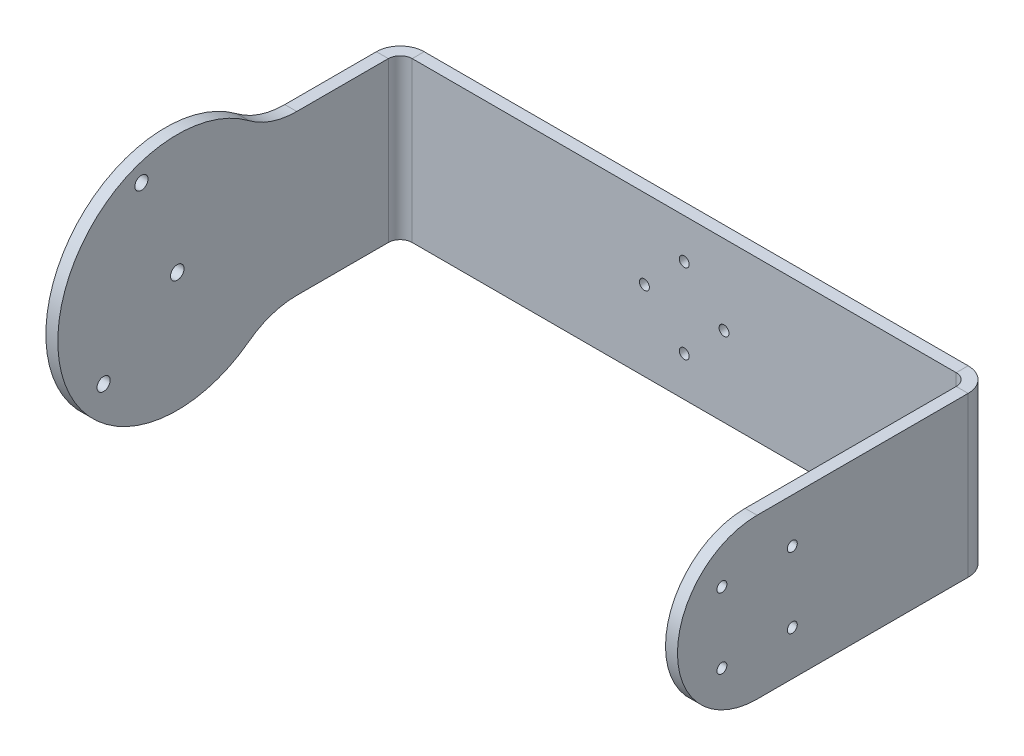
ISO-10303-21;
HEADER;
FILE_DESCRIPTION(('STEP AP214'),'2;1');
FILE_NAME('part.step','',(''),(''),'','','');
FILE_SCHEMA(('AUTOMOTIVE_DESIGN { 1 0 10303 214 1 1 1 1 }'));
ENDSEC;
DATA;
#1=APPLICATION_CONTEXT('core data for automotive mechanical design processes');
#2=APPLICATION_PROTOCOL_DEFINITION('international standard','automotive_design',2000,#1);
#3=PRODUCT_CONTEXT('',#1,'mechanical');
#4=PRODUCT('Part','Part','',(#3));
#5=PRODUCT_RELATED_PRODUCT_CATEGORY('part','',(#4));
#6=PRODUCT_DEFINITION_FORMATION('','',#4);
#7=PRODUCT_DEFINITION_CONTEXT('part definition',#1,'design');
#8=PRODUCT_DEFINITION('design','',#6,#7);
#9=PRODUCT_DEFINITION_SHAPE('','',#8);
#10=(LENGTH_UNIT() NAMED_UNIT(*) SI_UNIT(.MILLI.,.METRE.));
#11=(NAMED_UNIT(*) PLANE_ANGLE_UNIT() SI_UNIT($,.RADIAN.));
#12=(NAMED_UNIT(*) SI_UNIT($,.STERADIAN.) SOLID_ANGLE_UNIT());
#13=UNCERTAINTY_MEASURE_WITH_UNIT(LENGTH_MEASURE(1.E-05),#10,'distance_accuracy_value','');
#14=(GEOMETRIC_REPRESENTATION_CONTEXT(3) GLOBAL_UNCERTAINTY_ASSIGNED_CONTEXT((#13)) GLOBAL_UNIT_ASSIGNED_CONTEXT((#10,
#11,#12)) REPRESENTATION_CONTEXT('',''));
#15=CARTESIAN_POINT('',(0.,0.,0.));
#16=DIRECTION('',(0.,0.,1.));
#17=DIRECTION('',(1.,0.,0.));
#18=AXIS2_PLACEMENT_3D('',#15,#16,#17);
#19=CARTESIAN_POINT('',(0.,0.,-3.));
#20=DIRECTION('',(0.,0.,1.));
#21=DIRECTION('',(1.,0.,0.));
#22=AXIS2_PLACEMENT_3D('',#19,#20,#21);
#23=PLANE('',#22);
#24=CARTESIAN_POINT('',(0.,-10.,-3.));
#25=DIRECTION('',(0.,0.,1.));
#26=DIRECTION('',(1.,0.,0.));
#27=AXIS2_PLACEMENT_3D('',#24,#25,#26);
#28=CIRCLE('',#27,1.25);
#29=CARTESIAN_POINT('',(1.24999999999993,-10.,-3.));
#30=VERTEX_POINT('',#29);
#31=EDGE_CURVE('E379',#30,#30,#28,.F.);
#32=ORIENTED_EDGE('',*,*,#31,.F.);
#33=EDGE_LOOP('',(#32));
#34=FACE_BOUND('',#33,.T.);
#35=CARTESIAN_POINT('',(10.,0.,-3.));
#36=DIRECTION('',(0.,0.,1.));
#37=DIRECTION('',(1.,0.,0.));
#38=AXIS2_PLACEMENT_3D('',#35,#36,#37);
#39=CIRCLE('',#38,1.25);
#40=CARTESIAN_POINT('',(11.25,0.,-3.));
#41=VERTEX_POINT('',#40);
#42=EDGE_CURVE('E384',#41,#41,#39,.F.);
#43=ORIENTED_EDGE('',*,*,#42,.F.);
#44=EDGE_LOOP('',(#43));
#45=FACE_BOUND('',#44,.T.);
#46=CARTESIAN_POINT('',(0.,10.,-3.));
#47=DIRECTION('',(0.,0.,1.));
#48=DIRECTION('',(1.,0.,0.));
#49=AXIS2_PLACEMENT_3D('',#46,#47,#48);
#50=CIRCLE('',#49,1.25);
#51=CARTESIAN_POINT('',(1.25,10.,-3.));
#52=VERTEX_POINT('',#51);
#53=EDGE_CURVE('E390',#52,#52,#50,.F.);
#54=ORIENTED_EDGE('',*,*,#53,.F.);
#55=EDGE_LOOP('',(#54));
#56=FACE_BOUND('',#55,.T.);
#57=CARTESIAN_POINT('',(-10.,1.04744440165294E-13,-3.));
#58=DIRECTION('',(0.,0.,1.));
#59=DIRECTION('',(1.,0.,0.));
#60=AXIS2_PLACEMENT_3D('',#57,#58,#59);
#61=CIRCLE('',#60,1.25);
#62=CARTESIAN_POINT('',(-8.75,1.04744440165294E-13,-3.));
#63=VERTEX_POINT('',#62);
#64=EDGE_CURVE('E171',#63,#63,#61,.F.);
#65=ORIENTED_EDGE('',*,*,#64,.F.);
#66=EDGE_LOOP('',(#65));
#67=FACE_BOUND('',#66,.T.);
#68=DIRECTION('',(0.,1.,0.));
#69=VECTOR('',#68,1.);
#70=CARTESIAN_POINT('',(68.3,20.,-3.));
#71=LINE('',#70,#69);
#72=CARTESIAN_POINT('',(68.3,20.,-3.));
#73=VERTEX_POINT('',#72);
#74=CARTESIAN_POINT('',(68.3,-20.,-3.));
#75=VERTEX_POINT('',#74);
#76=EDGE_CURVE('E197',#73,#75,#71,.F.);
#77=ORIENTED_EDGE('',*,*,#76,.T.);
#78=DIRECTION('',(1.,0.,0.));
#79=VECTOR('',#78,1.);
#80=CARTESIAN_POINT('',(-71.3,-20.,-3.));
#81=LINE('',#80,#79);
#82=CARTESIAN_POINT('',(-68.3,-20.,-3.));
#83=VERTEX_POINT('',#82);
#84=EDGE_CURVE('E265',#83,#75,#81,.T.);
#85=ORIENTED_EDGE('',*,*,#84,.F.);
#86=DIRECTION('',(0.,-1.,0.));
#87=VECTOR('',#86,1.);
#88=CARTESIAN_POINT('',(-68.3,-20.,-3.));
#89=LINE('',#88,#87);
#90=CARTESIAN_POINT('',(-68.3,20.,-3.));
#91=VERTEX_POINT('',#90);
#92=EDGE_CURVE('E241',#83,#91,#89,.F.);
#93=ORIENTED_EDGE('',*,*,#92,.T.);
#94=DIRECTION('',(-1.,0.,0.));
#95=VECTOR('',#94,1.);
#96=CARTESIAN_POINT('',(-71.3,20.,-3.));
#97=LINE('',#96,#95);
#98=EDGE_CURVE('E268',#73,#91,#97,.T.);
#99=ORIENTED_EDGE('',*,*,#98,.F.);
#100=EDGE_LOOP('',(#77,#85,#93,#99));
#101=FACE_BOUND('',#100,.T.);
#102=ADVANCED_FACE('F60',(#34,#45,#56,#67,#101),#23,.F.);
#103=CARTESIAN_POINT('',(0.,0.,0.));
#104=DIRECTION('',(0.,0.,1.));
#105=DIRECTION('',(1.,0.,0.));
#106=AXIS2_PLACEMENT_3D('',#103,#104,#105);
#107=PLANE('',#106);
#108=CARTESIAN_POINT('',(0.,-10.,0.));
#109=DIRECTION('',(0.,0.,1.));
#110=DIRECTION('',(1.,0.,0.));
#111=AXIS2_PLACEMENT_3D('',#108,#109,#110);
#112=CIRCLE('',#111,1.25);
#113=CARTESIAN_POINT('',(1.24999999999993,-10.,0.));
#114=VERTEX_POINT('',#113);
#115=EDGE_CURVE('E376',#114,#114,#112,.T.);
#116=ORIENTED_EDGE('',*,*,#115,.F.);
#117=EDGE_LOOP('',(#116));
#118=FACE_BOUND('',#117,.T.);
#119=CARTESIAN_POINT('',(10.,0.,0.));
#120=DIRECTION('',(0.,0.,1.));
#121=DIRECTION('',(1.,0.,0.));
#122=AXIS2_PLACEMENT_3D('',#119,#120,#121);
#123=CIRCLE('',#122,1.25);
#124=CARTESIAN_POINT('',(11.25,0.,0.));
#125=VERTEX_POINT('',#124);
#126=EDGE_CURVE('E380',#125,#125,#123,.T.);
#127=ORIENTED_EDGE('',*,*,#126,.F.);
#128=EDGE_LOOP('',(#127));
#129=FACE_BOUND('',#128,.T.);
#130=CARTESIAN_POINT('',(0.,10.,0.));
#131=DIRECTION('',(0.,0.,1.));
#132=DIRECTION('',(1.,0.,0.));
#133=AXIS2_PLACEMENT_3D('',#130,#131,#132);
#134=CIRCLE('',#133,1.25);
#135=CARTESIAN_POINT('',(1.25,10.,0.));
#136=VERTEX_POINT('',#135);
#137=EDGE_CURVE('E387',#136,#136,#134,.T.);
#138=ORIENTED_EDGE('',*,*,#137,.F.);
#139=EDGE_LOOP('',(#138));
#140=FACE_BOUND('',#139,.T.);
#141=CARTESIAN_POINT('',(-10.,1.04744440165294E-13,0.));
#142=DIRECTION('',(0.,0.,1.));
#143=DIRECTION('',(1.,0.,0.));
#144=AXIS2_PLACEMENT_3D('',#141,#142,#143);
#145=CIRCLE('',#144,1.25);
#146=CARTESIAN_POINT('',(-8.75,1.04744440165294E-13,0.));
#147=VERTEX_POINT('',#146);
#148=EDGE_CURVE('E393',#147,#147,#145,.T.);
#149=ORIENTED_EDGE('',*,*,#148,.F.);
#150=EDGE_LOOP('',(#149));
#151=FACE_BOUND('',#150,.T.);
#152=DIRECTION('',(1.,0.,0.));
#153=VECTOR('',#152,1.);
#154=CARTESIAN_POINT('',(-71.3,-20.,0.));
#155=LINE('',#154,#153);
#156=CARTESIAN_POINT('',(-68.3,-20.,0.));
#157=VERTEX_POINT('',#156);
#158=CARTESIAN_POINT('',(68.3,-20.,0.));
#159=VERTEX_POINT('',#158);
#160=EDGE_CURVE('E262',#157,#159,#155,.T.);
#161=ORIENTED_EDGE('',*,*,#160,.T.);
#162=DIRECTION('',(0.,1.,0.));
#163=VECTOR('',#162,1.);
#164=CARTESIAN_POINT('',(68.3,20.,0.));
#165=LINE('',#164,#163);
#166=CARTESIAN_POINT('',(68.3,20.,0.));
#167=VERTEX_POINT('',#166);
#168=EDGE_CURVE('E209',#167,#159,#165,.F.);
#169=ORIENTED_EDGE('',*,*,#168,.F.);
#170=DIRECTION('',(-1.,0.,0.));
#171=VECTOR('',#170,1.);
#172=CARTESIAN_POINT('',(-71.3,20.,0.));
#173=LINE('',#172,#171);
#174=CARTESIAN_POINT('',(-68.3,20.,0.));
#175=VERTEX_POINT('',#174);
#176=EDGE_CURVE('E269',#167,#175,#173,.T.);
#177=ORIENTED_EDGE('',*,*,#176,.T.);
#178=DIRECTION('',(0.,-1.,0.));
#179=VECTOR('',#178,1.);
#180=CARTESIAN_POINT('',(-68.3,-20.,0.));
#181=LINE('',#180,#179);
#182=EDGE_CURVE('E254',#157,#175,#181,.F.);
#183=ORIENTED_EDGE('',*,*,#182,.F.);
#184=EDGE_LOOP('',(#161,#169,#177,#183));
#185=FACE_BOUND('',#184,.T.);
#186=ADVANCED_FACE('F326',(#118,#129,#140,#151,#185),#107,.T.);
#187=CARTESIAN_POINT('',(-71.3,20.,-3.));
#188=DIRECTION('',(0.,1.,0.));
#189=DIRECTION('',(0.,0.,1.));
#190=AXIS2_PLACEMENT_3D('',#187,#188,#189);
#191=PLANE('',#190);
#192=ORIENTED_EDGE('',*,*,#176,.F.);
#193=DIRECTION('',(0.,0.,-1.));
#194=VECTOR('',#193,1.);
#195=CARTESIAN_POINT('',(68.3,20.,0.));
#196=LINE('',#195,#194);
#197=EDGE_CURVE('E203',#167,#73,#196,.T.);
#198=ORIENTED_EDGE('',*,*,#197,.T.);
#199=ORIENTED_EDGE('',*,*,#98,.T.);
#200=DIRECTION('',(0.,0.,-1.));
#201=VECTOR('',#200,1.);
#202=CARTESIAN_POINT('',(-68.3,20.,0.));
#203=LINE('',#202,#201);
#204=EDGE_CURVE('E259',#175,#91,#203,.T.);
#205=ORIENTED_EDGE('',*,*,#204,.F.);
#206=EDGE_LOOP('',(#192,#198,#199,#205));
#207=FACE_BOUND('',#206,.T.);
#208=ADVANCED_FACE('F319',(#207),#191,.T.);
#209=CARTESIAN_POINT('',(-71.3,-20.,-3.));
#210=DIRECTION('',(0.,-1.,0.));
#211=DIRECTION('',(0.,0.,-1.));
#212=AXIS2_PLACEMENT_3D('',#209,#210,#211);
#213=PLANE('',#212);
#214=DIRECTION('',(0.,0.,-1.));
#215=VECTOR('',#214,1.);
#216=CARTESIAN_POINT('',(68.3,-20.,0.));
#217=LINE('',#216,#215);
#218=EDGE_CURVE('E214',#159,#75,#217,.T.);
#219=ORIENTED_EDGE('',*,*,#218,.F.);
#220=ORIENTED_EDGE('',*,*,#160,.F.);
#221=DIRECTION('',(0.,0.,-1.));
#222=VECTOR('',#221,1.);
#223=CARTESIAN_POINT('',(-68.3,-20.,0.));
#224=LINE('',#223,#222);
#225=EDGE_CURVE('E248',#157,#83,#224,.T.);
#226=ORIENTED_EDGE('',*,*,#225,.T.);
#227=ORIENTED_EDGE('',*,*,#84,.T.);
#228=EDGE_LOOP('',(#219,#220,#226,#227));
#229=FACE_BOUND('',#228,.T.);
#230=ADVANCED_FACE('F329',(#229),#213,.T.);
#231=CARTESIAN_POINT('',(-68.3,20.,3.));
#232=DIRECTION('',(0.,1.,0.));
#233=DIRECTION('',(0.,0.,1.));
#234=AXIS2_PLACEMENT_3D('',#231,#232,#233);
#235=PLANE('',#234);
#236=DIRECTION('',(-1.,0.,0.));
#237=VECTOR('',#236,1.);
#238=CARTESIAN_POINT('',(-71.3,20.,2.99999999999999));
#239=LINE('',#238,#237);
#240=CARTESIAN_POINT('',(-71.3,20.,2.99999999999999));
#241=VERTEX_POINT('',#240);
#242=CARTESIAN_POINT('',(-74.3,20.,2.99999999999998));
#243=VERTEX_POINT('',#242);
#244=EDGE_CURVE('E217',#241,#243,#239,.T.);
#245=ORIENTED_EDGE('',*,*,#244,.F.);
#246=CARTESIAN_POINT('',(-68.3,20.,3.));
#247=DIRECTION('',(0.,-1.,0.));
#248=DIRECTION('',(0.,0.,-1.));
#249=AXIS2_PLACEMENT_3D('',#246,#247,#248);
#250=CIRCLE('',#249,3.);
#251=EDGE_CURVE('E251',#175,#241,#250,.F.);
#252=ORIENTED_EDGE('',*,*,#251,.F.);
#253=ORIENTED_EDGE('',*,*,#204,.T.);
#254=CARTESIAN_POINT('',(-68.3,20.,3.));
#255=DIRECTION('',(0.,-1.,0.));
#256=DIRECTION('',(0.,0.,-1.));
#257=AXIS2_PLACEMENT_3D('',#254,#255,#256);
#258=CIRCLE('',#257,6.);
#259=EDGE_CURVE('E244',#91,#243,#258,.F.);
#260=ORIENTED_EDGE('',*,*,#259,.T.);
#261=EDGE_LOOP('',(#245,#252,#253,#260));
#262=FACE_BOUND('',#261,.T.);
#263=ADVANCED_FACE('F314',(#262),#235,.T.);
#264=CARTESIAN_POINT('',(-68.3,-20.,3.));
#265=DIRECTION('',(0.,1.,0.));
#266=DIRECTION('',(0.,0.,1.));
#267=AXIS2_PLACEMENT_3D('',#264,#265,#266);
#268=PLANE('',#267);
#269=CARTESIAN_POINT('',(-68.3,-20.,3.));
#270=DIRECTION('',(0.,-1.,0.));
#271=DIRECTION('',(0.,0.,-1.));
#272=AXIS2_PLACEMENT_3D('',#269,#270,#271);
#273=CIRCLE('',#272,3.);
#274=CARTESIAN_POINT('',(-71.3,-20.,2.99999999999999));
#275=VERTEX_POINT('',#274);
#276=EDGE_CURVE('E237',#275,#157,#273,.T.);
#277=ORIENTED_EDGE('',*,*,#276,.F.);
#278=DIRECTION('',(-1.,0.,0.));
#279=VECTOR('',#278,1.);
#280=CARTESIAN_POINT('',(-71.3,-20.,2.99999999999999));
#281=LINE('',#280,#279);
#282=CARTESIAN_POINT('',(-74.3,-20.,2.99999999999998));
#283=VERTEX_POINT('',#282);
#284=EDGE_CURVE('E222',#275,#283,#281,.T.);
#285=ORIENTED_EDGE('',*,*,#284,.T.);
#286=CARTESIAN_POINT('',(-68.3,-20.,3.));
#287=DIRECTION('',(0.,-1.,0.));
#288=DIRECTION('',(0.,0.,-1.));
#289=AXIS2_PLACEMENT_3D('',#286,#287,#288);
#290=CIRCLE('',#289,6.);
#291=EDGE_CURVE('E245',#283,#83,#290,.T.);
#292=ORIENTED_EDGE('',*,*,#291,.T.);
#293=ORIENTED_EDGE('',*,*,#225,.F.);
#294=EDGE_LOOP('',(#277,#285,#292,#293));
#295=FACE_BOUND('',#294,.T.);
#296=ADVANCED_FACE('F331',(#295),#268,.F.);
#297=CARTESIAN_POINT('',(-68.3,-20.,3.));
#298=DIRECTION('',(0.,-1.,0.));
#299=DIRECTION('',(-1.,0.,0.));
#300=AXIS2_PLACEMENT_3D('',#297,#298,#299);
#301=CYLINDRICAL_SURFACE('',#300,6.);
#302=ORIENTED_EDGE('',*,*,#92,.F.);
#303=ORIENTED_EDGE('',*,*,#291,.F.);
#304=DIRECTION('',(0.,1.,0.));
#305=VECTOR('',#304,1.);
#306=CARTESIAN_POINT('',(-74.3,0.,2.99999999999998));
#307=LINE('',#306,#305);
#308=EDGE_CURVE('E225',#283,#243,#307,.T.);
#309=ORIENTED_EDGE('',*,*,#308,.T.);
#310=ORIENTED_EDGE('',*,*,#259,.F.);
#311=EDGE_LOOP('',(#302,#303,#309,#310));
#312=FACE_BOUND('',#311,.T.);
#313=ADVANCED_FACE('F312',(#312),#301,.T.);
#314=CARTESIAN_POINT('',(-68.3,-20.,3.));
#315=DIRECTION('',(0.,-1.,0.));
#316=DIRECTION('',(-1.,0.,0.));
#317=AXIS2_PLACEMENT_3D('',#314,#315,#316);
#318=CYLINDRICAL_SURFACE('',#317,3.);
#319=ORIENTED_EDGE('',*,*,#182,.T.);
#320=ORIENTED_EDGE('',*,*,#251,.T.);
#321=DIRECTION('',(0.,-1.,0.));
#322=VECTOR('',#321,1.);
#323=CARTESIAN_POINT('',(-71.3,20.,2.99999999999999));
#324=LINE('',#323,#322);
#325=EDGE_CURVE('E220',#241,#275,#324,.T.);
#326=ORIENTED_EDGE('',*,*,#325,.T.);
#327=ORIENTED_EDGE('',*,*,#276,.T.);
#328=EDGE_LOOP('',(#319,#320,#326,#327));
#329=FACE_BOUND('',#328,.T.);
#330=ADVANCED_FACE('F322',(#329),#318,.F.);
#331=CARTESIAN_POINT('',(-74.3,20.,0.));
#332=DIRECTION('',(0.,-1.,0.));
#333=DIRECTION('',(0.,0.,-1.));
#334=AXIS2_PLACEMENT_3D('',#331,#332,#333);
#335=PLANE('',#334);
#336=DIRECTION('',(0.,0.,-1.));
#337=VECTOR('',#336,1.);
#338=CARTESIAN_POINT('',(-74.3,20.,0.));
#339=LINE('',#338,#337);
#340=CARTESIAN_POINT('',(-74.3000000000001,20.,26.));
#341=VERTEX_POINT('',#340);
#342=EDGE_CURVE('E231',#341,#243,#339,.T.);
#343=ORIENTED_EDGE('',*,*,#342,.F.);
#344=DIRECTION('',(-1.,0.,0.));
#345=VECTOR('',#344,1.);
#346=CARTESIAN_POINT('',(-74.3000000000001,20.,26.));
#347=LINE('',#346,#345);
#348=CARTESIAN_POINT('',(-71.3000000000001,20.,26.));
#349=VERTEX_POINT('',#348);
#350=EDGE_CURVE('E281',#341,#349,#347,.F.);
#351=ORIENTED_EDGE('',*,*,#350,.T.);
#352=DIRECTION('',(0.,0.,-1.));
#353=VECTOR('',#352,1.);
#354=CARTESIAN_POINT('',(-71.3,20.,0.));
#355=LINE('',#354,#353);
#356=EDGE_CURVE('E230',#349,#241,#355,.T.);
#357=ORIENTED_EDGE('',*,*,#356,.T.);
#358=ORIENTED_EDGE('',*,*,#244,.T.);
#359=EDGE_LOOP('',(#343,#351,#357,#358));
#360=FACE_BOUND('',#359,.T.);
#361=ADVANCED_FACE('F303',(#360),#335,.F.);
#362=CARTESIAN_POINT('',(-74.3000000000002,-20.,56.));
#363=DIRECTION('',(0.,1.,0.));
#364=DIRECTION('',(0.,0.,1.));
#365=AXIS2_PLACEMENT_3D('',#362,#363,#364);
#366=PLANE('',#365);
#367=DIRECTION('',(0.,0.,1.));
#368=VECTOR('',#367,1.);
#369=CARTESIAN_POINT('',(-71.3000000000002,-20.,56.));
#370=LINE('',#369,#368);
#371=CARTESIAN_POINT('',(-71.3000000000001,-20.,26.));
#372=VERTEX_POINT('',#371);
#373=EDGE_CURVE('E234',#275,#372,#370,.T.);
#374=ORIENTED_EDGE('',*,*,#373,.T.);
#375=DIRECTION('',(-1.,0.,0.));
#376=VECTOR('',#375,1.);
#377=CARTESIAN_POINT('',(-74.3000000000001,-20.,26.));
#378=LINE('',#377,#376);
#379=CARTESIAN_POINT('',(-74.3000000000001,-20.,26.));
#380=VERTEX_POINT('',#379);
#381=EDGE_CURVE('E271',#372,#380,#378,.T.);
#382=ORIENTED_EDGE('',*,*,#381,.T.);
#383=DIRECTION('',(0.,0.,1.));
#384=VECTOR('',#383,1.);
#385=CARTESIAN_POINT('',(-74.3000000000002,-20.,56.));
#386=LINE('',#385,#384);
#387=EDGE_CURVE('E233',#283,#380,#386,.T.);
#388=ORIENTED_EDGE('',*,*,#387,.F.);
#389=ORIENTED_EDGE('',*,*,#284,.F.);
#390=EDGE_LOOP('',(#374,#382,#388,#389));
#391=FACE_BOUND('',#390,.T.);
#392=ADVANCED_FACE('F335',(#391),#366,.F.);
#393=CARTESIAN_POINT('',(-74.3,0.,-2.57846011690822E-13));
#394=DIRECTION('',(1.,0.,0.));
#395=DIRECTION('',(0.,0.,-1.));
#396=AXIS2_PLACEMENT_3D('',#393,#394,#395);
#397=PLANE('',#396);
#398=ORIENTED_EDGE('',*,*,#387,.T.);
#399=CARTESIAN_POINT('',(-74.3000000000001,-40.,26.));
#400=DIRECTION('',(1.,0.,0.));
#401=DIRECTION('',(0.,0.,-1.));
#402=AXIS2_PLACEMENT_3D('',#399,#400,#401);
#403=CIRCLE('',#402,20.);
#404=CARTESIAN_POINT('',(-74.3000000000001,-24.,38.));
#405=VERTEX_POINT('',#404);
#406=EDGE_CURVE('E283',#380,#405,#403,.T.);
#407=ORIENTED_EDGE('',*,*,#406,.T.);
#408=CARTESIAN_POINT('',(-74.3000000000002,0.,56.));
#409=DIRECTION('',(-1.,0.,0.));
#410=DIRECTION('',(0.,0.,1.));
#411=AXIS2_PLACEMENT_3D('',#408,#409,#410);
#412=CIRCLE('',#411,30.);
#413=CARTESIAN_POINT('',(-74.3000000000001,24.,38.));
#414=VERTEX_POINT('',#413);
#415=EDGE_CURVE('E300',#405,#414,#412,.T.);
#416=ORIENTED_EDGE('',*,*,#415,.T.);
#417=CARTESIAN_POINT('',(-74.3000000000001,40.,26.));
#418=DIRECTION('',(1.,0.,0.));
#419=DIRECTION('',(0.,0.,-1.));
#420=AXIS2_PLACEMENT_3D('',#417,#418,#419);
#421=CIRCLE('',#420,20.);
#422=EDGE_CURVE('E12',#414,#341,#421,.T.);
#423=ORIENTED_EDGE('',*,*,#422,.T.);
#424=ORIENTED_EDGE('',*,*,#342,.T.);
#425=ORIENTED_EDGE('',*,*,#308,.F.);
#426=EDGE_LOOP('',(#398,#407,#416,#423,#424,#425));
#427=FACE_BOUND('',#426,.T.);
#428=CARTESIAN_POINT('',(-74.3000000000002,0.,56.));
#429=DIRECTION('',(-1.,0.,0.));
#430=DIRECTION('',(0.,0.,1.));
#431=AXIS2_PLACEMENT_3D('',#428,#429,#430);
#432=CIRCLE('',#431,1.7);
#433=CARTESIAN_POINT('',(-74.3000000000002,0.,57.7));
#434=VERTEX_POINT('',#433);
#435=EDGE_CURVE('E348',#434,#434,#432,.T.);
#436=ORIENTED_EDGE('',*,*,#435,.F.);
#437=EDGE_LOOP('',(#436));
#438=FACE_BOUND('',#437,.T.);
#439=CARTESIAN_POINT('',(-74.3000000000002,24.,65.));
#440=DIRECTION('',(-1.,0.,0.));
#441=DIRECTION('',(0.,0.,1.));
#442=AXIS2_PLACEMENT_3D('',#439,#440,#441);
#443=CIRCLE('',#442,1.65);
#444=CARTESIAN_POINT('',(-74.3000000000002,24.,66.65));
#445=VERTEX_POINT('',#444);
#446=EDGE_CURVE('E342',#445,#445,#443,.T.);
#447=ORIENTED_EDGE('',*,*,#446,.F.);
#448=EDGE_LOOP('',(#447));
#449=FACE_BOUND('',#448,.T.);
#450=CARTESIAN_POINT('',(-74.3000000000003,-15.,74.5));
#451=DIRECTION('',(-1.,0.,0.));
#452=DIRECTION('',(0.,0.,1.));
#453=AXIS2_PLACEMENT_3D('',#450,#451,#452);
#454=CIRCLE('',#453,1.65);
#455=CARTESIAN_POINT('',(-74.3000000000003,-15.,76.15));
#456=VERTEX_POINT('',#455);
#457=EDGE_CURVE('E865',#456,#456,#454,.T.);
#458=ORIENTED_EDGE('',*,*,#457,.F.);
#459=EDGE_LOOP('',(#458));
#460=FACE_BOUND('',#459,.T.);
#461=ADVANCED_FACE('F306',(#427,#438,#449,#460),#397,.F.);
#462=CARTESIAN_POINT('',(-71.3,0.,-2.47371567674293E-13));
#463=DIRECTION('',(1.,0.,0.));
#464=DIRECTION('',(0.,0.,-1.));
#465=AXIS2_PLACEMENT_3D('',#462,#463,#464);
#466=PLANE('',#465);
#467=ORIENTED_EDGE('',*,*,#356,.F.);
#468=CARTESIAN_POINT('',(-71.3000000000001,40.,26.));
#469=DIRECTION('',(1.,0.,0.));
#470=DIRECTION('',(0.,0.,-1.));
#471=AXIS2_PLACEMENT_3D('',#468,#469,#470);
#472=CIRCLE('',#471,20.);
#473=CARTESIAN_POINT('',(-71.3000000000001,24.,38.));
#474=VERTEX_POINT('',#473);
#475=EDGE_CURVE('E68',#349,#474,#472,.F.);
#476=ORIENTED_EDGE('',*,*,#475,.T.);
#477=CARTESIAN_POINT('',(-71.3000000000002,0.,56.));
#478=DIRECTION('',(-1.,0.,0.));
#479=DIRECTION('',(0.,0.,1.));
#480=AXIS2_PLACEMENT_3D('',#477,#478,#479);
#481=CIRCLE('',#480,30.);
#482=CARTESIAN_POINT('',(-71.3000000000001,-24.,38.));
#483=VERTEX_POINT('',#482);
#484=EDGE_CURVE('E292',#483,#474,#481,.T.);
#485=ORIENTED_EDGE('',*,*,#484,.F.);
#486=CARTESIAN_POINT('',(-71.3000000000001,-40.,26.));
#487=DIRECTION('',(1.,0.,0.));
#488=DIRECTION('',(0.,0.,-1.));
#489=AXIS2_PLACEMENT_3D('',#486,#487,#488);
#490=CIRCLE('',#489,20.);
#491=EDGE_CURVE('E285',#483,#372,#490,.F.);
#492=ORIENTED_EDGE('',*,*,#491,.T.);
#493=ORIENTED_EDGE('',*,*,#373,.F.);
#494=ORIENTED_EDGE('',*,*,#325,.F.);
#495=EDGE_LOOP('',(#467,#476,#485,#492,#493,#494));
#496=FACE_BOUND('',#495,.T.);
#497=CARTESIAN_POINT('',(-71.3000000000002,0.,56.));
#498=DIRECTION('',(1.,0.,0.));
#499=DIRECTION('',(0.,0.,-1.));
#500=AXIS2_PLACEMENT_3D('',#497,#498,#499);
#501=CIRCLE('',#500,1.7);
#502=CARTESIAN_POINT('',(-71.3000000000002,0.,54.3));
#503=VERTEX_POINT('',#502);
#504=EDGE_CURVE('E299',#503,#503,#501,.F.);
#505=ORIENTED_EDGE('',*,*,#504,.T.);
#506=EDGE_LOOP('',(#505));
#507=FACE_BOUND('',#506,.T.);
#508=CARTESIAN_POINT('',(-71.3000000000002,24.,65.));
#509=DIRECTION('',(-1.,0.,0.));
#510=DIRECTION('',(0.,0.,1.));
#511=AXIS2_PLACEMENT_3D('',#508,#509,#510);
#512=CIRCLE('',#511,1.65);
#513=CARTESIAN_POINT('',(-71.3000000000002,24.,66.65));
#514=VERTEX_POINT('',#513);
#515=EDGE_CURVE('E339',#514,#514,#512,.T.);
#516=ORIENTED_EDGE('',*,*,#515,.T.);
#517=EDGE_LOOP('',(#516));
#518=FACE_BOUND('',#517,.T.);
#519=CARTESIAN_POINT('',(-71.3000000000003,-15.,74.5));
#520=DIRECTION('',(-1.,0.,0.));
#521=DIRECTION('',(0.,0.,1.));
#522=AXIS2_PLACEMENT_3D('',#519,#520,#521);
#523=CIRCLE('',#522,1.65);
#524=CARTESIAN_POINT('',(-71.3000000000003,-15.,76.15));
#525=VERTEX_POINT('',#524);
#526=EDGE_CURVE('E866',#525,#525,#523,.T.);
#527=ORIENTED_EDGE('',*,*,#526,.T.);
#528=EDGE_LOOP('',(#527));
#529=FACE_BOUND('',#528,.T.);
#530=ADVANCED_FACE('F290',(#496,#507,#518,#529),#466,.T.);
#531=CARTESIAN_POINT('',(68.3,-20.,3.));
#532=DIRECTION('',(0.,-1.,0.));
#533=DIRECTION('',(0.,0.,-1.));
#534=AXIS2_PLACEMENT_3D('',#531,#532,#533);
#535=PLANE('',#534);
#536=DIRECTION('',(1.,0.,0.));
#537=VECTOR('',#536,1.);
#538=CARTESIAN_POINT('',(71.3,-20.,2.99999999999999));
#539=LINE('',#538,#537);
#540=CARTESIAN_POINT('',(71.3,-20.,2.99999999999999));
#541=VERTEX_POINT('',#540);
#542=CARTESIAN_POINT('',(74.3,-20.,2.99999999999998));
#543=VERTEX_POINT('',#542);
#544=EDGE_CURVE('E383',#541,#543,#539,.T.);
#545=ORIENTED_EDGE('',*,*,#544,.F.);
#546=CARTESIAN_POINT('',(68.3,-20.,3.));
#547=DIRECTION('',(0.,1.,0.));
#548=DIRECTION('',(0.,0.,1.));
#549=AXIS2_PLACEMENT_3D('',#546,#547,#548);
#550=CIRCLE('',#549,3.);
#551=EDGE_CURVE('E206',#159,#541,#550,.F.);
#552=ORIENTED_EDGE('',*,*,#551,.F.);
#553=ORIENTED_EDGE('',*,*,#218,.T.);
#554=CARTESIAN_POINT('',(68.3,-20.,3.));
#555=DIRECTION('',(0.,1.,0.));
#556=DIRECTION('',(0.,0.,1.));
#557=AXIS2_PLACEMENT_3D('',#554,#555,#556);
#558=CIRCLE('',#557,6.);
#559=EDGE_CURVE('E199',#75,#543,#558,.F.);
#560=ORIENTED_EDGE('',*,*,#559,.T.);
#561=EDGE_LOOP('',(#545,#552,#553,#560));
#562=FACE_BOUND('',#561,.T.);
#563=ADVANCED_FACE('F418',(#562),#535,.T.);
#564=CARTESIAN_POINT('',(68.3,20.,3.));
#565=DIRECTION('',(0.,-1.,0.));
#566=DIRECTION('',(0.,0.,-1.));
#567=AXIS2_PLACEMENT_3D('',#564,#565,#566);
#568=PLANE('',#567);
#569=CARTESIAN_POINT('',(68.3,20.,3.));
#570=DIRECTION('',(0.,1.,0.));
#571=DIRECTION('',(0.,0.,1.));
#572=AXIS2_PLACEMENT_3D('',#569,#570,#571);
#573=CIRCLE('',#572,3.);
#574=CARTESIAN_POINT('',(71.3,20.,2.99999999999999));
#575=VERTEX_POINT('',#574);
#576=EDGE_CURVE('E196',#575,#167,#573,.T.);
#577=ORIENTED_EDGE('',*,*,#576,.F.);
#578=DIRECTION('',(1.,0.,0.));
#579=VECTOR('',#578,1.);
#580=CARTESIAN_POINT('',(71.3,20.,2.99999999999999));
#581=LINE('',#580,#579);
#582=CARTESIAN_POINT('',(74.3,20.,2.99999999999998));
#583=VERTEX_POINT('',#582);
#584=EDGE_CURVE('E190',#575,#583,#581,.T.);
#585=ORIENTED_EDGE('',*,*,#584,.T.);
#586=CARTESIAN_POINT('',(68.3,20.,3.));
#587=DIRECTION('',(0.,1.,0.));
#588=DIRECTION('',(0.,0.,1.));
#589=AXIS2_PLACEMENT_3D('',#586,#587,#588);
#590=CIRCLE('',#589,6.);
#591=EDGE_CURVE('E200',#583,#73,#590,.T.);
#592=ORIENTED_EDGE('',*,*,#591,.T.);
#593=ORIENTED_EDGE('',*,*,#197,.F.);
#594=EDGE_LOOP('',(#577,#585,#592,#593));
#595=FACE_BOUND('',#594,.T.);
#596=ADVANCED_FACE('F413',(#595),#568,.F.);
#597=CARTESIAN_POINT('',(68.3,20.,3.));
#598=DIRECTION('',(0.,1.,0.));
#599=DIRECTION('',(1.,0.,0.));
#600=AXIS2_PLACEMENT_3D('',#597,#598,#599);
#601=CYLINDRICAL_SURFACE('',#600,6.);
#602=ORIENTED_EDGE('',*,*,#76,.F.);
#603=ORIENTED_EDGE('',*,*,#591,.F.);
#604=DIRECTION('',(0.,-1.,0.));
#605=VECTOR('',#604,1.);
#606=CARTESIAN_POINT('',(74.3,0.,2.99999999999998));
#607=LINE('',#606,#605);
#608=EDGE_CURVE('E187',#583,#543,#607,.T.);
#609=ORIENTED_EDGE('',*,*,#608,.T.);
#610=ORIENTED_EDGE('',*,*,#559,.F.);
#611=EDGE_LOOP('',(#602,#603,#609,#610));
#612=FACE_BOUND('',#611,.T.);
#613=ADVANCED_FACE('F422',(#612),#601,.T.);
#614=CARTESIAN_POINT('',(68.3,20.,3.));
#615=DIRECTION('',(0.,1.,0.));
#616=DIRECTION('',(1.,0.,0.));
#617=AXIS2_PLACEMENT_3D('',#614,#615,#616);
#618=CYLINDRICAL_SURFACE('',#617,3.);
#619=ORIENTED_EDGE('',*,*,#168,.T.);
#620=ORIENTED_EDGE('',*,*,#551,.T.);
#621=DIRECTION('',(0.,1.,0.));
#622=VECTOR('',#621,1.);
#623=CARTESIAN_POINT('',(71.3,-20.,2.99999999999999));
#624=LINE('',#623,#622);
#625=EDGE_CURVE('E185',#541,#575,#624,.T.);
#626=ORIENTED_EDGE('',*,*,#625,.T.);
#627=ORIENTED_EDGE('',*,*,#576,.T.);
#628=EDGE_LOOP('',(#619,#620,#626,#627));
#629=FACE_BOUND('',#628,.T.);
#630=ADVANCED_FACE('F415',(#629),#618,.F.);
#631=CARTESIAN_POINT('',(74.3,-20.,0.));
#632=DIRECTION('',(0.,1.,0.));
#633=DIRECTION('',(0.,0.,1.));
#634=AXIS2_PLACEMENT_3D('',#631,#632,#633);
#635=PLANE('',#634);
#636=ORIENTED_EDGE('',*,*,#544,.T.);
#637=DIRECTION('',(0.,0.,-1.));
#638=VECTOR('',#637,1.);
#639=CARTESIAN_POINT('',(74.3,-20.,0.));
#640=LINE('',#639,#638);
#641=CARTESIAN_POINT('',(74.3000000000002,-20.,56.));
#642=VERTEX_POINT('',#641);
#643=EDGE_CURVE('E180',#642,#543,#640,.T.);
#644=ORIENTED_EDGE('',*,*,#643,.F.);
#645=DIRECTION('',(-1.,0.,0.));
#646=VECTOR('',#645,1.);
#647=CARTESIAN_POINT('',(74.3000000000002,-20.,56.));
#648=LINE('',#647,#646);
#649=CARTESIAN_POINT('',(71.3000000000002,-20.,56.));
#650=VERTEX_POINT('',#649);
#651=EDGE_CURVE('E163',#642,#650,#648,.T.);
#652=ORIENTED_EDGE('',*,*,#651,.T.);
#653=DIRECTION('',(0.,0.,-1.));
#654=VECTOR('',#653,1.);
#655=CARTESIAN_POINT('',(71.3,-20.,0.));
#656=LINE('',#655,#654);
#657=EDGE_CURVE('E178',#650,#541,#656,.T.);
#658=ORIENTED_EDGE('',*,*,#657,.T.);
#659=EDGE_LOOP('',(#636,#644,#652,#658));
#660=FACE_BOUND('',#659,.T.);
#661=ADVANCED_FACE('F177',(#660),#635,.F.);
#662=CARTESIAN_POINT('',(74.3000000000002,20.,56.));
#663=DIRECTION('',(0.,-1.,0.));
#664=DIRECTION('',(0.,0.,-1.));
#665=AXIS2_PLACEMENT_3D('',#662,#663,#664);
#666=PLANE('',#665);
#667=ORIENTED_EDGE('',*,*,#584,.F.);
#668=DIRECTION('',(0.,0.,1.));
#669=VECTOR('',#668,1.);
#670=CARTESIAN_POINT('',(71.3000000000002,20.,56.));
#671=LINE('',#670,#669);
#672=CARTESIAN_POINT('',(71.3000000000002,20.,56.));
#673=VERTEX_POINT('',#672);
#674=EDGE_CURVE('E186',#575,#673,#671,.T.);
#675=ORIENTED_EDGE('',*,*,#674,.T.);
#676=DIRECTION('',(-1.,0.,0.));
#677=VECTOR('',#676,1.);
#678=CARTESIAN_POINT('',(74.3000000000002,20.,56.));
#679=LINE('',#678,#677);
#680=CARTESIAN_POINT('',(74.3000000000002,20.,56.));
#681=VERTEX_POINT('',#680);
#682=EDGE_CURVE('E166',#681,#673,#679,.T.);
#683=ORIENTED_EDGE('',*,*,#682,.F.);
#684=DIRECTION('',(0.,0.,1.));
#685=VECTOR('',#684,1.);
#686=CARTESIAN_POINT('',(74.3000000000002,20.,56.));
#687=LINE('',#686,#685);
#688=EDGE_CURVE('E181',#583,#681,#687,.T.);
#689=ORIENTED_EDGE('',*,*,#688,.F.);
#690=EDGE_LOOP('',(#667,#675,#683,#689));
#691=FACE_BOUND('',#690,.T.);
#692=ADVANCED_FACE('F410',(#691),#666,.F.);
#693=CARTESIAN_POINT('',(74.3,0.,-2.57846011690822E-13));
#694=DIRECTION('',(-1.,0.,0.));
#695=DIRECTION('',(0.,0.,1.));
#696=AXIS2_PLACEMENT_3D('',#693,#694,#695);
#697=PLANE('',#696);
#698=CARTESIAN_POINT('',(74.3000000000002,-8.83883476483179,64.8388347648319));
#699=DIRECTION('',(1.,0.,0.));
#700=DIRECTION('',(0.,0.,-1.));
#701=AXIS2_PLACEMENT_3D('',#698,#699,#700);
#702=CIRCLE('',#701,1.25);
#703=CARTESIAN_POINT('',(74.3000000000002,-8.83883476483179,63.5888347648319));
#704=VERTEX_POINT('',#703);
#705=EDGE_CURVE('E351',#704,#704,#702,.T.);
#706=ORIENTED_EDGE('',*,*,#705,.F.);
#707=EDGE_LOOP('',(#706));
#708=FACE_BOUND('',#707,.T.);
#709=CARTESIAN_POINT('',(74.3000000000002,-8.83883476483189,47.1611652351682));
#710=DIRECTION('',(1.,0.,0.));
#711=DIRECTION('',(0.,0.,-1.));
#712=AXIS2_PLACEMENT_3D('',#709,#710,#711);
#713=CIRCLE('',#712,1.25);
#714=CARTESIAN_POINT('',(74.3000000000002,-8.83883476483189,45.9111652351682));
#715=VERTEX_POINT('',#714);
#716=EDGE_CURVE('E362',#715,#715,#713,.T.);
#717=ORIENTED_EDGE('',*,*,#716,.F.);
#718=EDGE_LOOP('',(#717));
#719=FACE_BOUND('',#718,.T.);
#720=CARTESIAN_POINT('',(74.3000000000002,8.83883476483179,47.1611652351681));
#721=DIRECTION('',(1.,0.,0.));
#722=DIRECTION('',(0.,0.,-1.));
#723=AXIS2_PLACEMENT_3D('',#720,#721,#722);
#724=CIRCLE('',#723,1.25);
#725=CARTESIAN_POINT('',(74.3000000000002,8.83883476483179,45.9111652351681));
#726=VERTEX_POINT('',#725);
#727=EDGE_CURVE('E356',#726,#726,#724,.T.);
#728=ORIENTED_EDGE('',*,*,#727,.F.);
#729=EDGE_LOOP('',(#728));
#730=FACE_BOUND('',#729,.T.);
#731=CARTESIAN_POINT('',(74.3000000000002,8.83883476483189,64.8388347648318));
#732=DIRECTION('',(1.,0.,0.));
#733=DIRECTION('',(0.,0.,-1.));
#734=AXIS2_PLACEMENT_3D('',#731,#732,#733);
#735=CIRCLE('',#734,1.25000000000001);
#736=CARTESIAN_POINT('',(74.3000000000002,8.83883476483189,63.5888347648318));
#737=VERTEX_POINT('',#736);
#738=EDGE_CURVE('E370',#737,#737,#735,.T.);
#739=ORIENTED_EDGE('',*,*,#738,.F.);
#740=EDGE_LOOP('',(#739));
#741=FACE_BOUND('',#740,.T.);
#742=ORIENTED_EDGE('',*,*,#608,.F.);
#743=ORIENTED_EDGE('',*,*,#688,.T.);
#744=CARTESIAN_POINT('',(74.3000000000002,0.,56.));
#745=DIRECTION('',(1.,0.,0.));
#746=DIRECTION('',(0.,0.,-1.));
#747=AXIS2_PLACEMENT_3D('',#744,#745,#746);
#748=CIRCLE('',#747,20.);
#749=EDGE_CURVE('E172',#681,#642,#748,.T.);
#750=ORIENTED_EDGE('',*,*,#749,.T.);
#751=ORIENTED_EDGE('',*,*,#643,.T.);
#752=EDGE_LOOP('',(#742,#743,#750,#751));
#753=FACE_BOUND('',#752,.T.);
#754=ADVANCED_FACE('F407',(#708,#719,#730,#741,#753),#697,.F.);
#755=CARTESIAN_POINT('',(71.3,0.,-2.47371567674293E-13));
#756=DIRECTION('',(-1.,0.,0.));
#757=DIRECTION('',(0.,0.,1.));
#758=AXIS2_PLACEMENT_3D('',#755,#756,#757);
#759=PLANE('',#758);
#760=CARTESIAN_POINT('',(71.3000000000002,-8.83883476483179,64.8388347648319));
#761=DIRECTION('',(-1.,0.,0.));
#762=DIRECTION('',(0.,0.,1.));
#763=AXIS2_PLACEMENT_3D('',#760,#761,#762);
#764=CIRCLE('',#763,1.25);
#765=CARTESIAN_POINT('',(71.3000000000002,-8.83883476483179,66.0888347648319));
#766=VERTEX_POINT('',#765);
#767=EDGE_CURVE('E365',#766,#766,#764,.F.);
#768=ORIENTED_EDGE('',*,*,#767,.T.);
#769=EDGE_LOOP('',(#768));
#770=FACE_BOUND('',#769,.T.);
#771=CARTESIAN_POINT('',(71.3000000000002,-8.83883476483189,47.1611652351682));
#772=DIRECTION('',(-1.,0.,0.));
#773=DIRECTION('',(0.,0.,1.));
#774=AXIS2_PLACEMENT_3D('',#771,#772,#773);
#775=CIRCLE('',#774,1.25);
#776=CARTESIAN_POINT('',(71.3000000000002,-8.83883476483189,48.4111652351682));
#777=VERTEX_POINT('',#776);
#778=EDGE_CURVE('E359',#777,#777,#775,.F.);
#779=ORIENTED_EDGE('',*,*,#778,.T.);
#780=EDGE_LOOP('',(#779));
#781=FACE_BOUND('',#780,.T.);
#782=CARTESIAN_POINT('',(71.3000000000002,8.83883476483179,47.1611652351681));
#783=DIRECTION('',(-1.,0.,0.));
#784=DIRECTION('',(0.,0.,1.));
#785=AXIS2_PLACEMENT_3D('',#782,#783,#784);
#786=CIRCLE('',#785,1.25);
#787=CARTESIAN_POINT('',(71.3000000000002,8.83883476483179,48.4111652351681));
#788=VERTEX_POINT('',#787);
#789=EDGE_CURVE('E352',#788,#788,#786,.F.);
#790=ORIENTED_EDGE('',*,*,#789,.T.);
#791=EDGE_LOOP('',(#790));
#792=FACE_BOUND('',#791,.T.);
#793=CARTESIAN_POINT('',(71.3000000000002,8.83883476483189,64.8388347648318));
#794=DIRECTION('',(-1.,0.,0.));
#795=DIRECTION('',(0.,0.,1.));
#796=AXIS2_PLACEMENT_3D('',#793,#794,#795);
#797=CIRCLE('',#796,1.25000000000001);
#798=CARTESIAN_POINT('',(71.3000000000002,8.83883476483189,66.0888347648318));
#799=VERTEX_POINT('',#798);
#800=EDGE_CURVE('E355',#799,#799,#797,.F.);
#801=ORIENTED_EDGE('',*,*,#800,.T.);
#802=EDGE_LOOP('',(#801));
#803=FACE_BOUND('',#802,.T.);
#804=ORIENTED_EDGE('',*,*,#674,.F.);
#805=ORIENTED_EDGE('',*,*,#625,.F.);
#806=ORIENTED_EDGE('',*,*,#657,.F.);
#807=CARTESIAN_POINT('',(71.3000000000002,0.,56.));
#808=DIRECTION('',(1.,0.,0.));
#809=DIRECTION('',(0.,0.,-1.));
#810=AXIS2_PLACEMENT_3D('',#807,#808,#809);
#811=CIRCLE('',#810,20.);
#812=EDGE_CURVE('E160',#673,#650,#811,.T.);
#813=ORIENTED_EDGE('',*,*,#812,.F.);
#814=EDGE_LOOP('',(#804,#805,#806,#813));
#815=FACE_BOUND('',#814,.T.);
#816=ADVANCED_FACE('F184',(#770,#781,#792,#803,#815),#759,.T.);
#817=CARTESIAN_POINT('',(-10.,1.04744440165294E-13,-3.001));
#818=DIRECTION('',(0.,0.,1.));
#819=DIRECTION('',(1.,0.,0.));
#820=AXIS2_PLACEMENT_3D('',#817,#818,#819);
#821=CYLINDRICAL_SURFACE('',#820,1.25);
#822=ORIENTED_EDGE('',*,*,#148,.T.);
#823=EDGE_LOOP('',(#822));
#824=FACE_BOUND('',#823,.T.);
#825=ORIENTED_EDGE('',*,*,#64,.T.);
#826=EDGE_LOOP('',(#825));
#827=FACE_BOUND('',#826,.T.);
#828=ADVANCED_FACE('F494',(#824,#827),#821,.F.);
#829=CARTESIAN_POINT('',(0.,10.,-3.001));
#830=DIRECTION('',(0.,0.,1.));
#831=DIRECTION('',(1.,0.,0.));
#832=AXIS2_PLACEMENT_3D('',#829,#830,#831);
#833=CYLINDRICAL_SURFACE('',#832,1.25);
#834=ORIENTED_EDGE('',*,*,#137,.T.);
#835=EDGE_LOOP('',(#834));
#836=FACE_BOUND('',#835,.T.);
#837=ORIENTED_EDGE('',*,*,#53,.T.);
#838=EDGE_LOOP('',(#837));
#839=FACE_BOUND('',#838,.T.);
#840=ADVANCED_FACE('F490',(#836,#839),#833,.F.);
#841=CARTESIAN_POINT('',(10.,0.,-3.001));
#842=DIRECTION('',(0.,0.,1.));
#843=DIRECTION('',(1.,0.,0.));
#844=AXIS2_PLACEMENT_3D('',#841,#842,#843);
#845=CYLINDRICAL_SURFACE('',#844,1.25);
#846=ORIENTED_EDGE('',*,*,#126,.T.);
#847=EDGE_LOOP('',(#846));
#848=FACE_BOUND('',#847,.T.);
#849=ORIENTED_EDGE('',*,*,#42,.T.);
#850=EDGE_LOOP('',(#849));
#851=FACE_BOUND('',#850,.T.);
#852=ADVANCED_FACE('F486',(#848,#851),#845,.F.);
#853=CARTESIAN_POINT('',(0.,-10.,-3.001));
#854=DIRECTION('',(0.,0.,1.));
#855=DIRECTION('',(1.,0.,0.));
#856=AXIS2_PLACEMENT_3D('',#853,#854,#855);
#857=CYLINDRICAL_SURFACE('',#856,1.25);
#858=ORIENTED_EDGE('',*,*,#115,.T.);
#859=EDGE_LOOP('',(#858));
#860=FACE_BOUND('',#859,.T.);
#861=ORIENTED_EDGE('',*,*,#31,.T.);
#862=EDGE_LOOP('',(#861));
#863=FACE_BOUND('',#862,.T.);
#864=ADVANCED_FACE('F483',(#860,#863),#857,.F.);
#865=CARTESIAN_POINT('',(71.3000000000002,0.,56.));
#866=DIRECTION('',(1.,0.,0.));
#867=DIRECTION('',(0.,0.,-1.));
#868=AXIS2_PLACEMENT_3D('',#865,#866,#867);
#869=CYLINDRICAL_SURFACE('',#868,20.);
#870=ORIENTED_EDGE('',*,*,#749,.F.);
#871=ORIENTED_EDGE('',*,*,#682,.T.);
#872=ORIENTED_EDGE('',*,*,#812,.T.);
#873=ORIENTED_EDGE('',*,*,#651,.F.);
#874=EDGE_LOOP('',(#870,#871,#872,#873));
#875=FACE_BOUND('',#874,.T.);
#876=ADVANCED_FACE('F162',(#875),#869,.T.);
#877=CARTESIAN_POINT('',(-74.3010000000002,8.83883476483189,64.8388347648323));
#878=DIRECTION('',(1.,0.,0.));
#879=DIRECTION('',(0.,0.,-1.));
#880=AXIS2_PLACEMENT_3D('',#877,#878,#879);
#881=CYLINDRICAL_SURFACE('',#880,1.25000000000001);
#882=ORIENTED_EDGE('',*,*,#800,.F.);
#883=EDGE_LOOP('',(#882));
#884=FACE_BOUND('',#883,.T.);
#885=ORIENTED_EDGE('',*,*,#738,.T.);
#886=EDGE_LOOP('',(#885));
#887=FACE_BOUND('',#886,.T.);
#888=ADVANCED_FACE('F470',(#884,#887),#881,.F.);
#889=CARTESIAN_POINT('',(-74.3010000000003,8.83883476483179,47.1611652351686));
#890=DIRECTION('',(1.,0.,0.));
#891=DIRECTION('',(0.,0.,-1.));
#892=AXIS2_PLACEMENT_3D('',#889,#890,#891);
#893=CYLINDRICAL_SURFACE('',#892,1.25);
#894=ORIENTED_EDGE('',*,*,#789,.F.);
#895=EDGE_LOOP('',(#894));
#896=FACE_BOUND('',#895,.T.);
#897=ORIENTED_EDGE('',*,*,#727,.T.);
#898=EDGE_LOOP('',(#897));
#899=FACE_BOUND('',#898,.T.);
#900=ADVANCED_FACE('F466',(#896,#899),#893,.F.);
#901=CARTESIAN_POINT('',(-74.3010000000003,-8.83883476483189,47.1611652351687));
#902=DIRECTION('',(1.,0.,0.));
#903=DIRECTION('',(0.,0.,-1.));
#904=AXIS2_PLACEMENT_3D('',#901,#902,#903);
#905=CYLINDRICAL_SURFACE('',#904,1.25);
#906=ORIENTED_EDGE('',*,*,#778,.F.);
#907=EDGE_LOOP('',(#906));
#908=FACE_BOUND('',#907,.T.);
#909=ORIENTED_EDGE('',*,*,#716,.T.);
#910=EDGE_LOOP('',(#909));
#911=FACE_BOUND('',#910,.T.);
#912=ADVANCED_FACE('F469',(#908,#911),#905,.F.);
#913=CARTESIAN_POINT('',(-74.3010000000002,-8.83883476483179,64.8388347648324));
#914=DIRECTION('',(1.,0.,0.));
#915=DIRECTION('',(0.,0.,-1.));
#916=AXIS2_PLACEMENT_3D('',#913,#914,#915);
#917=CYLINDRICAL_SURFACE('',#916,1.25);
#918=ORIENTED_EDGE('',*,*,#767,.F.);
#919=EDGE_LOOP('',(#918));
#920=FACE_BOUND('',#919,.T.);
#921=ORIENTED_EDGE('',*,*,#705,.T.);
#922=EDGE_LOOP('',(#921));
#923=FACE_BOUND('',#922,.T.);
#924=ADVANCED_FACE('F464',(#920,#923),#917,.F.);
#925=CARTESIAN_POINT('',(74.3010000000003,0.,56.0000000000005));
#926=DIRECTION('',(-1.,0.,0.));
#927=DIRECTION('',(0.,0.,1.));
#928=AXIS2_PLACEMENT_3D('',#925,#926,#927);
#929=CYLINDRICAL_SURFACE('',#928,1.7);
#930=ORIENTED_EDGE('',*,*,#504,.F.);
#931=EDGE_LOOP('',(#930));
#932=FACE_BOUND('',#931,.T.);
#933=ORIENTED_EDGE('',*,*,#435,.T.);
#934=EDGE_LOOP('',(#933));
#935=FACE_BOUND('',#934,.T.);
#936=ADVANCED_FACE('F461',(#932,#935),#929,.F.);
#937=CARTESIAN_POINT('',(-71.3000000000002,0.,56.));
#938=DIRECTION('',(-1.,0.,0.));
#939=DIRECTION('',(0.,0.,1.));
#940=AXIS2_PLACEMENT_3D('',#937,#938,#939);
#941=CYLINDRICAL_SURFACE('',#940,30.);
#942=ORIENTED_EDGE('',*,*,#415,.F.);
#943=DIRECTION('',(-1.,0.,0.));
#944=VECTOR('',#943,1.);
#945=CARTESIAN_POINT('',(-71.3000000000001,-24.,38.));
#946=LINE('',#945,#944);
#947=EDGE_CURVE('E279',#405,#483,#946,.F.);
#948=ORIENTED_EDGE('',*,*,#947,.T.);
#949=ORIENTED_EDGE('',*,*,#484,.T.);
#950=DIRECTION('',(-1.,0.,0.));
#951=VECTOR('',#950,1.);
#952=CARTESIAN_POINT('',(-71.3000000000001,24.,38.));
#953=LINE('',#952,#951);
#954=EDGE_CURVE('E277',#474,#414,#953,.T.);
#955=ORIENTED_EDGE('',*,*,#954,.T.);
#956=EDGE_LOOP('',(#942,#948,#949,#955));
#957=FACE_BOUND('',#956,.T.);
#958=ADVANCED_FACE('F297',(#957),#941,.T.);
#959=CARTESIAN_POINT('',(-71.3000000000002,24.,65.));
#960=DIRECTION('',(-1.,0.,0.));
#961=DIRECTION('',(0.,0.,1.));
#962=AXIS2_PLACEMENT_3D('',#959,#960,#961);
#963=CYLINDRICAL_SURFACE('',#962,1.65);
#964=ORIENTED_EDGE('',*,*,#515,.F.);
#965=EDGE_LOOP('',(#964));
#966=FACE_BOUND('',#965,.T.);
#967=ORIENTED_EDGE('',*,*,#446,.T.);
#968=EDGE_LOOP('',(#967));
#969=FACE_BOUND('',#968,.T.);
#970=ADVANCED_FACE('F448',(#966,#969),#963,.F.);
#971=CARTESIAN_POINT('',(-71.3000000000003,-15.,74.5));
#972=DIRECTION('',(-1.,0.,0.));
#973=DIRECTION('',(0.,0.,1.));
#974=AXIS2_PLACEMENT_3D('',#971,#972,#973);
#975=CYLINDRICAL_SURFACE('',#974,1.65);
#976=ORIENTED_EDGE('',*,*,#526,.F.);
#977=EDGE_LOOP('',(#976));
#978=FACE_BOUND('',#977,.T.);
#979=ORIENTED_EDGE('',*,*,#457,.T.);
#980=EDGE_LOOP('',(#979));
#981=FACE_BOUND('',#980,.T.);
#982=ADVANCED_FACE('F442',(#978,#981),#975,.F.);
#983=CARTESIAN_POINT('',(-71.3000000000001,-40.,26.));
#984=DIRECTION('',(-1.,0.,0.));
#985=DIRECTION('',(0.,0.,1.));
#986=AXIS2_PLACEMENT_3D('',#983,#984,#985);
#987=CYLINDRICAL_SURFACE('',#986,20.);
#988=ORIENTED_EDGE('',*,*,#491,.F.);
#989=ORIENTED_EDGE('',*,*,#947,.F.);
#990=ORIENTED_EDGE('',*,*,#406,.F.);
#991=ORIENTED_EDGE('',*,*,#381,.F.);
#992=EDGE_LOOP('',(#988,#989,#990,#991));
#993=FACE_BOUND('',#992,.T.);
#994=ADVANCED_FACE('F338',(#993),#987,.F.);
#995=CARTESIAN_POINT('',(-71.3000000000001,40.,26.));
#996=DIRECTION('',(-1.,0.,0.));
#997=DIRECTION('',(0.,0.,1.));
#998=AXIS2_PLACEMENT_3D('',#995,#996,#997);
#999=CYLINDRICAL_SURFACE('',#998,20.);
#1000=ORIENTED_EDGE('',*,*,#422,.F.);
#1001=ORIENTED_EDGE('',*,*,#954,.F.);
#1002=ORIENTED_EDGE('',*,*,#475,.F.);
#1003=ORIENTED_EDGE('',*,*,#350,.F.);
#1004=EDGE_LOOP('',(#1000,#1001,#1002,#1003));
#1005=FACE_BOUND('',#1004,.T.);
#1006=ADVANCED_FACE('F62',(#1005),#999,.F.);
#1007=CLOSED_SHELL('',(#102,#186,#208,#230,#263,#296,#313,#330,#361,#392,#461,#530,#563,#596,
#613,#630,#661,#692,#754,#816,#828,#840,#852,#864,#876,#888,#900,#912,#924,#936,#958,#970,#982,
#994,#1006));
#1008=MANIFOLD_SOLID_BREP('B2',#1007);
#1009=ADVANCED_BREP_SHAPE_REPRESENTATION('',(#18,#1008),#14);
#1010=SHAPE_DEFINITION_REPRESENTATION(#9,#1009);
ENDSEC;
END-ISO-10303-21;
